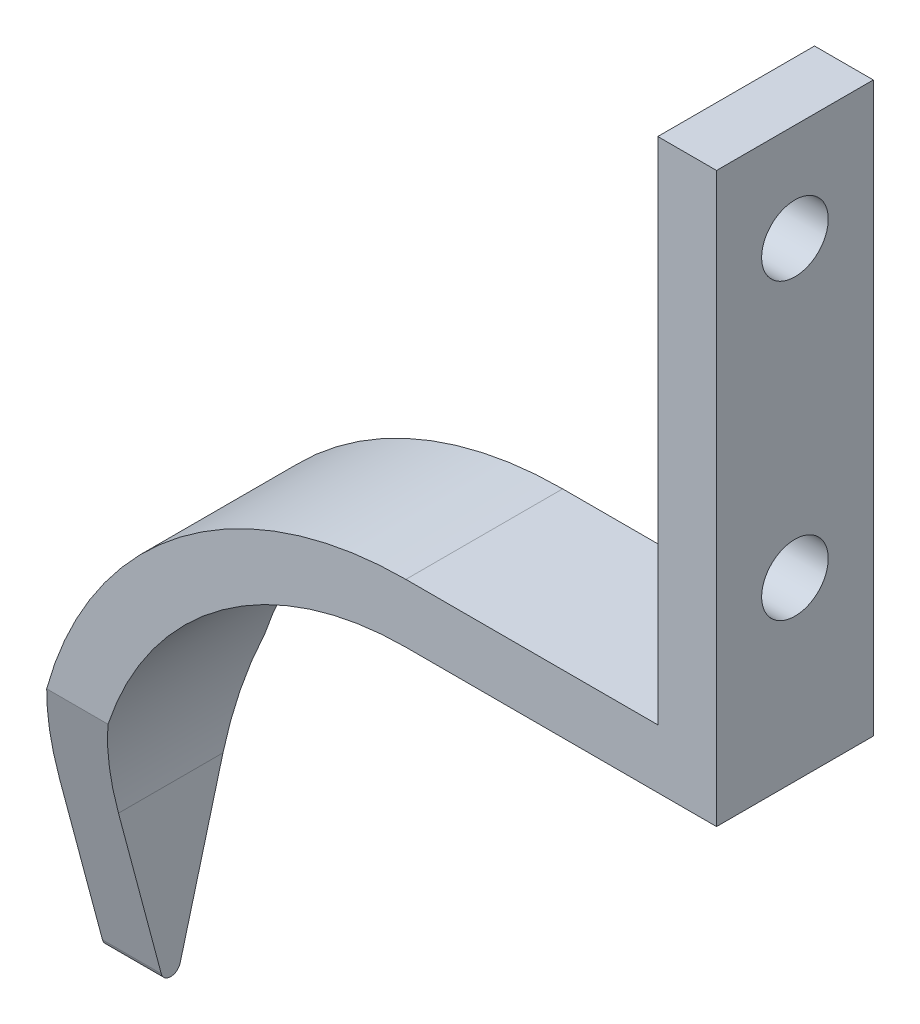
ISO-10303-21;
HEADER;
FILE_DESCRIPTION(('STEP AP214'),'2;1');
FILE_NAME('part.step','',(''),(''),'','','');
FILE_SCHEMA(('AUTOMOTIVE_DESIGN { 1 0 10303 214 1 1 1 1 }'));
ENDSEC;
DATA;
#1=APPLICATION_CONTEXT('core data for automotive mechanical design processes');
#2=APPLICATION_PROTOCOL_DEFINITION('international standard','automotive_design',2000,#1);
#3=PRODUCT_CONTEXT('',#1,'mechanical');
#4=PRODUCT('Part','Part','',(#3));
#5=PRODUCT_RELATED_PRODUCT_CATEGORY('part','',(#4));
#6=PRODUCT_DEFINITION_FORMATION('','',#4);
#7=PRODUCT_DEFINITION_CONTEXT('part definition',#1,'design');
#8=PRODUCT_DEFINITION('design','',#6,#7);
#9=PRODUCT_DEFINITION_SHAPE('','',#8);
#10=(LENGTH_UNIT() NAMED_UNIT(*) SI_UNIT(.MILLI.,.METRE.));
#11=(NAMED_UNIT(*) PLANE_ANGLE_UNIT() SI_UNIT($,.RADIAN.));
#12=(NAMED_UNIT(*) SI_UNIT($,.STERADIAN.) SOLID_ANGLE_UNIT());
#13=UNCERTAINTY_MEASURE_WITH_UNIT(LENGTH_MEASURE(1.E-05),#10,'distance_accuracy_value','');
#14=(GEOMETRIC_REPRESENTATION_CONTEXT(3) GLOBAL_UNCERTAINTY_ASSIGNED_CONTEXT((#13)) GLOBAL_UNIT_ASSIGNED_CONTEXT((#10,
#11,#12)) REPRESENTATION_CONTEXT('',''));
#15=CARTESIAN_POINT('',(0.,0.,0.));
#16=DIRECTION('',(0.,0.,1.));
#17=DIRECTION('',(1.,0.,0.));
#18=AXIS2_PLACEMENT_3D('',#15,#16,#17);
#19=CARTESIAN_POINT('',(-59.,0.,-4.00000000000001));
#20=DIRECTION('',(1.,0.,0.));
#21=DIRECTION('',(0.,0.,-1.));
#22=AXIS2_PLACEMENT_3D('',#19,#20,#21);
#23=PLANE('',#22);
#24=DIRECTION('',(0.,0.966234939601246,-0.257662650560332));
#25=VECTOR('',#24,1.);
#26=CARTESIAN_POINT('',(-59.,2.98755186721991,11.2033195020747));
#27=LINE('',#26,#25);
#28=CARTESIAN_POINT('',(-59.,46.8116905117523,-0.483117469800625));
#29=VERTEX_POINT('',#28);
#30=CARTESIAN_POINT('',(-59.,55.,-2.66666666666667));
#31=VERTEX_POINT('',#30);
#32=EDGE_CURVE('E130',#29,#31,#27,.T.);
#33=ORIENTED_EDGE('',*,*,#32,.F.);
#34=CARTESIAN_POINT('',(-59.,46.9405218370325,0.));
#35=DIRECTION('',(1.,0.,0.));
#36=DIRECTION('',(0.,0.,-1.));
#37=AXIS2_PLACEMENT_3D('',#34,#35,#36);
#38=CIRCLE('',#37,0.5);
#39=CARTESIAN_POINT('',(-59.,46.8116905117523,0.48311746980061));
#40=VERTEX_POINT('',#39);
#41=EDGE_CURVE('E58',#29,#40,#38,.F.);
#42=ORIENTED_EDGE('',*,*,#41,.T.);
#43=DIRECTION('',(0.,-0.966234939601246,-0.257662650560332));
#44=VECTOR('',#43,1.);
#45=CARTESIAN_POINT('',(-59.,2.98755186721991,-11.2033195020747));
#46=LINE('',#45,#44);
#47=CARTESIAN_POINT('',(-59.,55.,2.66666666666666));
#48=VERTEX_POINT('',#47);
#49=EDGE_CURVE('E124',#48,#40,#46,.T.);
#50=ORIENTED_EDGE('',*,*,#49,.F.);
#51=DIRECTION('',(0.,0.,1.));
#52=VECTOR('',#51,1.);
#53=CARTESIAN_POINT('',(-59.,55.,-4.));
#54=LINE('',#53,#52);
#55=EDGE_CURVE('E134',#31,#48,#54,.T.);
#56=ORIENTED_EDGE('',*,*,#55,.F.);
#57=EDGE_LOOP('',(#33,#42,#50,#56));
#58=FACE_BOUND('',#57,.T.);
#59=ADVANCED_FACE('F36',(#58),#23,.F.);
#60=CARTESIAN_POINT('',(-40.,55.,-4.));
#61=DIRECTION('',(0.,0.,1.));
#62=DIRECTION('',(1.,0.,0.));
#63=AXIS2_PLACEMENT_3D('',#60,#61,#62);
#64=CYLINDRICAL_SURFACE('',#63,19.);
#65=ORIENTED_EDGE('',*,*,#55,.T.);
#66=CARTESIAN_POINT('',(-40.,55.,2.66666666666666));
#67=DIRECTION('',(0.,0.257662650560332,-0.966234939601246));
#68=DIRECTION('',(0.,0.966234939601247,0.257662650560332));
#69=AXIS2_PLACEMENT_3D('',#66,#67,#68);
#70=ELLIPSE('',#69,19.6639546152627,19.);
#71=CARTESIAN_POINT('',(-58.3303027798234,60.,4.));
#72=VERTEX_POINT('',#71);
#73=EDGE_CURVE('E122',#48,#72,#70,.T.);
#74=ORIENTED_EDGE('',*,*,#73,.T.);
#75=CARTESIAN_POINT('',(-40.,55.,4.));
#76=DIRECTION('',(0.,0.,-1.));
#77=DIRECTION('',(-1.,0.,0.));
#78=AXIS2_PLACEMENT_3D('',#75,#76,#77);
#79=CIRCLE('',#78,19.);
#80=CARTESIAN_POINT('',(-40.,74.,4.));
#81=VERTEX_POINT('',#80);
#82=EDGE_CURVE('E168',#72,#81,#79,.T.);
#83=ORIENTED_EDGE('',*,*,#82,.T.);
#84=DIRECTION('',(0.,0.,1.));
#85=VECTOR('',#84,1.);
#86=CARTESIAN_POINT('',(-40.,74.,-4.));
#87=LINE('',#86,#85);
#88=CARTESIAN_POINT('',(-40.,74.,-4.));
#89=VERTEX_POINT('',#88);
#90=EDGE_CURVE('E142',#89,#81,#87,.T.);
#91=ORIENTED_EDGE('',*,*,#90,.F.);
#92=CARTESIAN_POINT('',(-40.,55.,-4.));
#93=DIRECTION('',(0.,0.,-1.));
#94=DIRECTION('',(-1.,0.,0.));
#95=AXIS2_PLACEMENT_3D('',#92,#93,#94);
#96=CIRCLE('',#95,19.);
#97=CARTESIAN_POINT('',(-58.3303027798234,60.,-4.));
#98=VERTEX_POINT('',#97);
#99=EDGE_CURVE('E169',#98,#89,#96,.T.);
#100=ORIENTED_EDGE('',*,*,#99,.F.);
#101=CARTESIAN_POINT('',(-40.,55.,-2.66666666666667));
#102=DIRECTION('',(0.,0.257662650560332,0.966234939601246));
#103=DIRECTION('',(0.,-0.966234939601247,0.257662650560332));
#104=AXIS2_PLACEMENT_3D('',#101,#102,#103);
#105=ELLIPSE('',#104,19.6639546152627,19.);
#106=EDGE_CURVE('E140',#98,#31,#105,.T.);
#107=ORIENTED_EDGE('',*,*,#106,.T.);
#108=EDGE_LOOP('',(#65,#74,#83,#91,#100,#107));
#109=FACE_BOUND('',#108,.T.);
#110=ADVANCED_FACE('F138',(#109),#64,.T.);
#111=CARTESIAN_POINT('',(0.,74.,-4.));
#112=DIRECTION('',(0.,-1.,0.));
#113=DIRECTION('',(1.,0.,0.));
#114=AXIS2_PLACEMENT_3D('',#111,#112,#113);
#115=PLANE('',#114);
#116=DIRECTION('',(1.,0.,0.));
#117=VECTOR('',#116,1.);
#118=CARTESIAN_POINT('',(0.,74.,4.));
#119=LINE('',#118,#117);
#120=CARTESIAN_POINT('',(-27.145,74.,4.));
#121=VERTEX_POINT('',#120);
#122=EDGE_CURVE('E187',#81,#121,#119,.T.);
#123=ORIENTED_EDGE('',*,*,#122,.T.);
#124=DIRECTION('',(0.,0.,1.));
#125=VECTOR('',#124,1.);
#126=CARTESIAN_POINT('',(-27.145,74.,-4.));
#127=LINE('',#126,#125);
#128=CARTESIAN_POINT('',(-27.145,74.,-4.));
#129=VERTEX_POINT('',#128);
#130=EDGE_CURVE('E147',#129,#121,#127,.T.);
#131=ORIENTED_EDGE('',*,*,#130,.F.);
#132=DIRECTION('',(1.,0.,0.));
#133=VECTOR('',#132,1.);
#134=CARTESIAN_POINT('',(0.,74.,-4.));
#135=LINE('',#134,#133);
#136=EDGE_CURVE('E171',#89,#129,#135,.T.);
#137=ORIENTED_EDGE('',*,*,#136,.F.);
#138=ORIENTED_EDGE('',*,*,#90,.T.);
#139=EDGE_LOOP('',(#123,#131,#137,#138));
#140=FACE_BOUND('',#139,.T.);
#141=ADVANCED_FACE('F242',(#140),#115,.F.);
#142=CARTESIAN_POINT('',(-27.145,0.,-4.));
#143=DIRECTION('',(1.,0.,0.));
#144=DIRECTION('',(0.,1.,0.));
#145=AXIS2_PLACEMENT_3D('',#142,#143,#144);
#146=PLANE('',#145);
#147=CARTESIAN_POINT('',(-27.145,80.,0.));
#148=DIRECTION('',(-1.,0.,0.));
#149=DIRECTION('',(0.,0.,1.));
#150=AXIS2_PLACEMENT_3D('',#147,#148,#149);
#151=CIRCLE('',#150,1.70000000000001);
#152=CARTESIAN_POINT('',(-27.145,80.,1.70000000000001));
#153=VERTEX_POINT('',#152);
#154=EDGE_CURVE('E397',#153,#153,#151,.T.);
#155=ORIENTED_EDGE('',*,*,#154,.F.);
#156=EDGE_LOOP('',(#155));
#157=FACE_BOUND('',#156,.T.);
#158=CARTESIAN_POINT('',(-27.145,95.,0.));
#159=DIRECTION('',(-1.,0.,0.));
#160=DIRECTION('',(0.,0.,1.));
#161=AXIS2_PLACEMENT_3D('',#158,#159,#160);
#162=CIRCLE('',#161,1.70000000000001);
#163=CARTESIAN_POINT('',(-27.145,95.,1.70000000000001));
#164=VERTEX_POINT('',#163);
#165=EDGE_CURVE('E394',#164,#164,#162,.T.);
#166=ORIENTED_EDGE('',*,*,#165,.F.);
#167=EDGE_LOOP('',(#166));
#168=FACE_BOUND('',#167,.T.);
#169=DIRECTION('',(0.,1.,0.));
#170=VECTOR('',#169,1.);
#171=CARTESIAN_POINT('',(-27.145,0.,4.));
#172=LINE('',#171,#170);
#173=CARTESIAN_POINT('',(-27.145,100.,4.));
#174=VERTEX_POINT('',#173);
#175=EDGE_CURVE('E189',#121,#174,#172,.T.);
#176=ORIENTED_EDGE('',*,*,#175,.T.);
#177=DIRECTION('',(0.,0.,1.));
#178=VECTOR('',#177,1.);
#179=CARTESIAN_POINT('',(-27.145,100.,-4.));
#180=LINE('',#179,#178);
#181=CARTESIAN_POINT('',(-27.145,100.,-4.));
#182=VERTEX_POINT('',#181);
#183=EDGE_CURVE('E210',#182,#174,#180,.T.);
#184=ORIENTED_EDGE('',*,*,#183,.F.);
#185=DIRECTION('',(0.,1.,0.));
#186=VECTOR('',#185,1.);
#187=CARTESIAN_POINT('',(-27.145,0.,-4.));
#188=LINE('',#187,#186);
#189=EDGE_CURVE('E174',#129,#182,#188,.T.);
#190=ORIENTED_EDGE('',*,*,#189,.F.);
#191=ORIENTED_EDGE('',*,*,#130,.T.);
#192=EDGE_LOOP('',(#176,#184,#190,#191));
#193=FACE_BOUND('',#192,.T.);
#194=ADVANCED_FACE('F217',(#157,#168,#193),#146,.F.);
#195=CARTESIAN_POINT('',(0.,100.,-4.));
#196=DIRECTION('',(0.,-1.,0.));
#197=DIRECTION('',(0.,0.,-1.));
#198=AXIS2_PLACEMENT_3D('',#195,#196,#197);
#199=PLANE('',#198);
#200=DIRECTION('',(1.,0.,0.));
#201=VECTOR('',#200,1.);
#202=CARTESIAN_POINT('',(0.,100.,4.));
#203=LINE('',#202,#201);
#204=CARTESIAN_POINT('',(-24.145,100.,4.));
#205=VERTEX_POINT('',#204);
#206=EDGE_CURVE('E191',#174,#205,#203,.T.);
#207=ORIENTED_EDGE('',*,*,#206,.T.);
#208=DIRECTION('',(0.,0.,1.));
#209=VECTOR('',#208,1.);
#210=CARTESIAN_POINT('',(-24.145,100.,-4.));
#211=LINE('',#210,#209);
#212=CARTESIAN_POINT('',(-24.145,100.,-4.));
#213=VERTEX_POINT('',#212);
#214=EDGE_CURVE('E207',#213,#205,#211,.T.);
#215=ORIENTED_EDGE('',*,*,#214,.F.);
#216=DIRECTION('',(1.,0.,0.));
#217=VECTOR('',#216,1.);
#218=CARTESIAN_POINT('',(0.,100.,-4.));
#219=LINE('',#218,#217);
#220=EDGE_CURVE('E176',#182,#213,#219,.T.);
#221=ORIENTED_EDGE('',*,*,#220,.F.);
#222=ORIENTED_EDGE('',*,*,#183,.T.);
#223=EDGE_LOOP('',(#207,#215,#221,#222));
#224=FACE_BOUND('',#223,.T.);
#225=ADVANCED_FACE('F229',(#224),#199,.F.);
#226=CARTESIAN_POINT('',(-24.145,0.,-4.));
#227=DIRECTION('',(-1.,0.,0.));
#228=DIRECTION('',(0.,0.,1.));
#229=AXIS2_PLACEMENT_3D('',#226,#227,#228);
#230=PLANE('',#229);
#231=CARTESIAN_POINT('',(-24.145,80.,0.));
#232=DIRECTION('',(-1.,0.,0.));
#233=DIRECTION('',(0.,0.,1.));
#234=AXIS2_PLACEMENT_3D('',#231,#232,#233);
#235=CIRCLE('',#234,1.70000000000001);
#236=CARTESIAN_POINT('',(-24.145,80.,1.70000000000001));
#237=VERTEX_POINT('',#236);
#238=EDGE_CURVE('E135',#237,#237,#235,.T.);
#239=ORIENTED_EDGE('',*,*,#238,.T.);
#240=EDGE_LOOP('',(#239));
#241=FACE_BOUND('',#240,.T.);
#242=CARTESIAN_POINT('',(-24.145,95.,0.));
#243=DIRECTION('',(-1.,0.,0.));
#244=DIRECTION('',(0.,0.,1.));
#245=AXIS2_PLACEMENT_3D('',#242,#243,#244);
#246=CIRCLE('',#245,1.70000000000001);
#247=CARTESIAN_POINT('',(-24.145,95.,1.70000000000001));
#248=VERTEX_POINT('',#247);
#249=EDGE_CURVE('E391',#248,#248,#246,.T.);
#250=ORIENTED_EDGE('',*,*,#249,.T.);
#251=EDGE_LOOP('',(#250));
#252=FACE_BOUND('',#251,.T.);
#253=DIRECTION('',(0.,-1.,0.));
#254=VECTOR('',#253,1.);
#255=CARTESIAN_POINT('',(-24.145,0.,4.));
#256=LINE('',#255,#254);
#257=CARTESIAN_POINT('',(-24.145,71.,4.));
#258=VERTEX_POINT('',#257);
#259=EDGE_CURVE('E193',#205,#258,#256,.T.);
#260=ORIENTED_EDGE('',*,*,#259,.T.);
#261=DIRECTION('',(0.,0.,1.));
#262=VECTOR('',#261,1.);
#263=CARTESIAN_POINT('',(-24.145,71.,-4.));
#264=LINE('',#263,#262);
#265=CARTESIAN_POINT('',(-24.145,71.,-4.));
#266=VERTEX_POINT('',#265);
#267=EDGE_CURVE('E204',#266,#258,#264,.T.);
#268=ORIENTED_EDGE('',*,*,#267,.F.);
#269=DIRECTION('',(0.,-1.,0.));
#270=VECTOR('',#269,1.);
#271=CARTESIAN_POINT('',(-24.145,0.,-4.));
#272=LINE('',#271,#270);
#273=EDGE_CURVE('E178',#213,#266,#272,.T.);
#274=ORIENTED_EDGE('',*,*,#273,.F.);
#275=ORIENTED_EDGE('',*,*,#214,.T.);
#276=EDGE_LOOP('',(#260,#268,#274,#275));
#277=FACE_BOUND('',#276,.T.);
#278=ADVANCED_FACE('F233',(#241,#252,#277),#230,.F.);
#279=CARTESIAN_POINT('',(0.,71.,-4.));
#280=DIRECTION('',(0.,1.,0.));
#281=DIRECTION('',(0.,0.,1.));
#282=AXIS2_PLACEMENT_3D('',#279,#280,#281);
#283=PLANE('',#282);
#284=DIRECTION('',(-1.,0.,0.));
#285=VECTOR('',#284,1.);
#286=CARTESIAN_POINT('',(0.,71.,4.));
#287=LINE('',#286,#285);
#288=CARTESIAN_POINT('',(-40.,71.,4.));
#289=VERTEX_POINT('',#288);
#290=EDGE_CURVE('E195',#258,#289,#287,.T.);
#291=ORIENTED_EDGE('',*,*,#290,.T.);
#292=DIRECTION('',(0.,0.,1.));
#293=VECTOR('',#292,1.);
#294=CARTESIAN_POINT('',(-40.,71.,-4.));
#295=LINE('',#294,#293);
#296=CARTESIAN_POINT('',(-40.,71.,-4.));
#297=VERTEX_POINT('',#296);
#298=EDGE_CURVE('E201',#297,#289,#295,.T.);
#299=ORIENTED_EDGE('',*,*,#298,.F.);
#300=DIRECTION('',(-1.,0.,0.));
#301=VECTOR('',#300,1.);
#302=CARTESIAN_POINT('',(0.,71.,-4.));
#303=LINE('',#302,#301);
#304=EDGE_CURVE('E180',#266,#297,#303,.T.);
#305=ORIENTED_EDGE('',*,*,#304,.F.);
#306=ORIENTED_EDGE('',*,*,#267,.T.);
#307=EDGE_LOOP('',(#291,#299,#305,#306));
#308=FACE_BOUND('',#307,.T.);
#309=ADVANCED_FACE('F252',(#308),#283,.F.);
#310=CARTESIAN_POINT('',(-40.,55.,-4.));
#311=DIRECTION('',(0.,0.,1.));
#312=DIRECTION('',(1.,0.,0.));
#313=AXIS2_PLACEMENT_3D('',#310,#311,#312);
#314=CYLINDRICAL_SURFACE('',#313,16.);
#315=CARTESIAN_POINT('',(-40.,55.,2.66666666666666));
#316=DIRECTION('',(0.,0.257662650560332,-0.966234939601246));
#317=DIRECTION('',(0.,0.966234939601247,0.257662650560332));
#318=AXIS2_PLACEMENT_3D('',#315,#316,#317);
#319=ELLIPSE('',#318,16.5591196760107,16.);
#320=CARTESIAN_POINT('',(-56.,55.,2.66666666666666));
#321=VERTEX_POINT('',#320);
#322=CARTESIAN_POINT('',(-55.1986841535707,60.,4.));
#323=VERTEX_POINT('',#322);
#324=EDGE_CURVE('E131',#321,#323,#319,.T.);
#325=ORIENTED_EDGE('',*,*,#324,.F.);
#326=DIRECTION('',(0.,0.,1.));
#327=VECTOR('',#326,1.);
#328=CARTESIAN_POINT('',(-56.,55.,-4.));
#329=LINE('',#328,#327);
#330=CARTESIAN_POINT('',(-56.,55.,-2.66666666666668));
#331=VERTEX_POINT('',#330);
#332=EDGE_CURVE('E185',#331,#321,#329,.T.);
#333=ORIENTED_EDGE('',*,*,#332,.F.);
#334=CARTESIAN_POINT('',(-40.,55.,-2.66666666666667));
#335=DIRECTION('',(0.,0.257662650560332,0.966234939601246));
#336=DIRECTION('',(0.,-0.966234939601247,0.257662650560332));
#337=AXIS2_PLACEMENT_3D('',#334,#335,#336);
#338=ELLIPSE('',#337,16.5591196760107,16.);
#339=CARTESIAN_POINT('',(-55.1986841535707,60.,-4.));
#340=VERTEX_POINT('',#339);
#341=EDGE_CURVE('E162',#340,#331,#338,.T.);
#342=ORIENTED_EDGE('',*,*,#341,.F.);
#343=CARTESIAN_POINT('',(-40.,55.,-4.));
#344=DIRECTION('',(0.,0.,-1.));
#345=DIRECTION('',(-1.,0.,0.));
#346=AXIS2_PLACEMENT_3D('',#343,#344,#345);
#347=CIRCLE('',#346,16.);
#348=EDGE_CURVE('E183',#340,#297,#347,.T.);
#349=ORIENTED_EDGE('',*,*,#348,.T.);
#350=ORIENTED_EDGE('',*,*,#298,.T.);
#351=CARTESIAN_POINT('',(-40.,55.,4.));
#352=DIRECTION('',(0.,0.,-1.));
#353=DIRECTION('',(-1.,0.,0.));
#354=AXIS2_PLACEMENT_3D('',#351,#352,#353);
#355=CIRCLE('',#354,16.);
#356=EDGE_CURVE('E172',#323,#289,#355,.T.);
#357=ORIENTED_EDGE('',*,*,#356,.F.);
#358=EDGE_LOOP('',(#325,#333,#342,#349,#350,#357));
#359=FACE_BOUND('',#358,.T.);
#360=ADVANCED_FACE('F248',(#359),#314,.F.);
#361=CARTESIAN_POINT('',(-56.,0.,-4.00000000000001));
#362=DIRECTION('',(-1.,0.,0.));
#363=DIRECTION('',(0.,-1.,0.));
#364=AXIS2_PLACEMENT_3D('',#361,#362,#363);
#365=PLANE('',#364);
#366=DIRECTION('',(0.,-0.966234939601247,-0.257662650560332));
#367=VECTOR('',#366,1.);
#368=CARTESIAN_POINT('',(-56.,1.99170124481324,-11.4688796680498));
#369=LINE('',#368,#367);
#370=CARTESIAN_POINT('',(-56.,46.8116905117523,0.48311746980062));
#371=VERTEX_POINT('',#370);
#372=EDGE_CURVE('E244',#321,#371,#369,.T.);
#373=ORIENTED_EDGE('',*,*,#372,.T.);
#374=CARTESIAN_POINT('',(-56.,46.9405218370325,0.));
#375=DIRECTION('',(-1.,0.,0.));
#376=DIRECTION('',(0.,-1.,0.));
#377=AXIS2_PLACEMENT_3D('',#374,#375,#376);
#378=CIRCLE('',#377,0.5);
#379=CARTESIAN_POINT('',(-56.,46.8116905117523,-0.483117469800636));
#380=VERTEX_POINT('',#379);
#381=EDGE_CURVE('E11',#371,#380,#378,.F.);
#382=ORIENTED_EDGE('',*,*,#381,.T.);
#383=DIRECTION('',(0.,0.966234939601247,-0.257662650560332));
#384=VECTOR('',#383,1.);
#385=CARTESIAN_POINT('',(-56.,3.98340248962651,10.9377593360996));
#386=LINE('',#385,#384);
#387=EDGE_CURVE('E158',#380,#331,#386,.T.);
#388=ORIENTED_EDGE('',*,*,#387,.T.);
#389=ORIENTED_EDGE('',*,*,#332,.T.);
#390=EDGE_LOOP('',(#373,#382,#388,#389));
#391=FACE_BOUND('',#390,.T.);
#392=ADVANCED_FACE('F259',(#391),#365,.F.);
#393=CARTESIAN_POINT('',(0.,0.,-4.));
#394=DIRECTION('',(0.,0.,-1.));
#395=DIRECTION('',(-1.,0.,0.));
#396=AXIS2_PLACEMENT_3D('',#393,#394,#395);
#397=PLANE('',#396);
#398=DIRECTION('',(1.,0.,0.));
#399=VECTOR('',#398,1.);
#400=CARTESIAN_POINT('',(0.,60.,-4.));
#401=LINE('',#400,#399);
#402=EDGE_CURVE('E141',#98,#340,#401,.T.);
#403=ORIENTED_EDGE('',*,*,#402,.F.);
#404=ORIENTED_EDGE('',*,*,#99,.T.);
#405=ORIENTED_EDGE('',*,*,#136,.T.);
#406=ORIENTED_EDGE('',*,*,#189,.T.);
#407=ORIENTED_EDGE('',*,*,#220,.T.);
#408=ORIENTED_EDGE('',*,*,#273,.T.);
#409=ORIENTED_EDGE('',*,*,#304,.T.);
#410=ORIENTED_EDGE('',*,*,#348,.F.);
#411=EDGE_LOOP('',(#403,#404,#405,#406,#407,#408,#409,#410));
#412=FACE_BOUND('',#411,.T.);
#413=ADVANCED_FACE('F238',(#412),#397,.T.);
#414=CARTESIAN_POINT('',(0.,0.,4.));
#415=DIRECTION('',(0.,0.,-1.));
#416=DIRECTION('',(-1.,0.,0.));
#417=AXIS2_PLACEMENT_3D('',#414,#415,#416);
#418=PLANE('',#417);
#419=ORIENTED_EDGE('',*,*,#82,.F.);
#420=DIRECTION('',(-1.,0.,0.));
#421=VECTOR('',#420,1.);
#422=CARTESIAN_POINT('',(-24.145,60.,4.));
#423=LINE('',#422,#421);
#424=EDGE_CURVE('E126',#323,#72,#423,.T.);
#425=ORIENTED_EDGE('',*,*,#424,.F.);
#426=ORIENTED_EDGE('',*,*,#356,.T.);
#427=ORIENTED_EDGE('',*,*,#290,.F.);
#428=ORIENTED_EDGE('',*,*,#259,.F.);
#429=ORIENTED_EDGE('',*,*,#206,.F.);
#430=ORIENTED_EDGE('',*,*,#175,.F.);
#431=ORIENTED_EDGE('',*,*,#122,.F.);
#432=EDGE_LOOP('',(#419,#425,#426,#427,#428,#429,#430,#431));
#433=FACE_BOUND('',#432,.T.);
#434=ADVANCED_FACE('F224',(#433),#418,.F.);
#435=CARTESIAN_POINT('',(-24.145,2.98755186721991,11.2033195020747));
#436=DIRECTION('',(0.,0.257662650560332,0.966234939601246));
#437=DIRECTION('',(0.,-0.966234939601247,0.257662650560332));
#438=AXIS2_PLACEMENT_3D('',#435,#436,#437);
#439=PLANE('',#438);
#440=ORIENTED_EDGE('',*,*,#387,.F.);
#441=DIRECTION('',(-1.,0.,0.));
#442=VECTOR('',#441,1.);
#443=CARTESIAN_POINT('',(-24.145,46.8116905117523,-0.483117469800625));
#444=LINE('',#443,#442);
#445=EDGE_CURVE('E144',#380,#29,#444,.T.);
#446=ORIENTED_EDGE('',*,*,#445,.T.);
#447=ORIENTED_EDGE('',*,*,#32,.T.);
#448=ORIENTED_EDGE('',*,*,#106,.F.);
#449=ORIENTED_EDGE('',*,*,#402,.T.);
#450=ORIENTED_EDGE('',*,*,#341,.T.);
#451=EDGE_LOOP('',(#440,#446,#447,#448,#449,#450));
#452=FACE_BOUND('',#451,.T.);
#453=ADVANCED_FACE('F156',(#452),#439,.F.);
#454=CARTESIAN_POINT('',(-24.145,2.98755186721991,-11.2033195020747));
#455=DIRECTION('',(0.,0.257662650560332,-0.966234939601246));
#456=DIRECTION('',(0.,0.966234939601247,0.257662650560332));
#457=AXIS2_PLACEMENT_3D('',#454,#455,#456);
#458=PLANE('',#457);
#459=ORIENTED_EDGE('',*,*,#49,.T.);
#460=DIRECTION('',(-1.,0.,0.));
#461=VECTOR('',#460,1.);
#462=CARTESIAN_POINT('',(-24.145,46.8116905117523,0.483117469800618));
#463=LINE('',#462,#461);
#464=EDGE_CURVE('E44',#40,#371,#463,.F.);
#465=ORIENTED_EDGE('',*,*,#464,.T.);
#466=ORIENTED_EDGE('',*,*,#372,.F.);
#467=ORIENTED_EDGE('',*,*,#324,.T.);
#468=ORIENTED_EDGE('',*,*,#424,.T.);
#469=ORIENTED_EDGE('',*,*,#73,.F.);
#470=EDGE_LOOP('',(#459,#465,#466,#467,#468,#469));
#471=FACE_BOUND('',#470,.T.);
#472=ADVANCED_FACE('F123',(#471),#458,.F.);
#473=CARTESIAN_POINT('',(-24.145,46.9405218370325,0.));
#474=DIRECTION('',(-1.,0.,0.));
#475=DIRECTION('',(0.,0.,1.));
#476=AXIS2_PLACEMENT_3D('',#473,#474,#475);
#477=CYLINDRICAL_SURFACE('',#476,0.5);
#478=ORIENTED_EDGE('',*,*,#381,.F.);
#479=ORIENTED_EDGE('',*,*,#464,.F.);
#480=ORIENTED_EDGE('',*,*,#41,.F.);
#481=ORIENTED_EDGE('',*,*,#445,.F.);
#482=EDGE_LOOP('',(#478,#479,#480,#481));
#483=FACE_BOUND('',#482,.T.);
#484=ADVANCED_FACE('F38',(#483),#477,.T.);
#485=CARTESIAN_POINT('',(-24.145,95.,0.));
#486=DIRECTION('',(-1.,0.,0.));
#487=DIRECTION('',(0.,0.,1.));
#488=AXIS2_PLACEMENT_3D('',#485,#486,#487);
#489=CYLINDRICAL_SURFACE('',#488,1.70000000000001);
#490=CARTESIAN_POINT('',(-24.145,95.,1.70000000000001));
#491=CARTESIAN_POINT('',(-24.17625,95.,1.70000000000001));
#492=CARTESIAN_POINT('',(-24.2075,95.,1.70000000000001));
#493=CARTESIAN_POINT('',(-24.27,95.,1.70000000000001));
#494=CARTESIAN_POINT('',(-24.30125,95.,1.70000000000001));
#495=CARTESIAN_POINT('',(-24.36375,95.,1.70000000000001));
#496=CARTESIAN_POINT('',(-24.395,95.,1.70000000000001));
#497=CARTESIAN_POINT('',(-24.4575,95.,1.70000000000001));
#498=CARTESIAN_POINT('',(-24.48875,95.,1.70000000000001));
#499=CARTESIAN_POINT('',(-24.55125,95.,1.70000000000001));
#500=CARTESIAN_POINT('',(-24.5825,95.,1.70000000000001));
#501=CARTESIAN_POINT('',(-24.645,95.,1.70000000000001));
#502=CARTESIAN_POINT('',(-24.67625,95.,1.70000000000001));
#503=CARTESIAN_POINT('',(-24.73875,95.,1.70000000000001));
#504=CARTESIAN_POINT('',(-24.77,95.,1.70000000000001));
#505=CARTESIAN_POINT('',(-24.8325,95.,1.70000000000001));
#506=CARTESIAN_POINT('',(-24.86375,95.,1.70000000000001));
#507=CARTESIAN_POINT('',(-24.92625,95.,1.70000000000001));
#508=CARTESIAN_POINT('',(-24.9575,95.,1.70000000000001));
#509=CARTESIAN_POINT('',(-25.02,95.,1.70000000000001));
#510=CARTESIAN_POINT('',(-25.05125,95.,1.70000000000001));
#511=CARTESIAN_POINT('',(-25.11375,95.,1.70000000000001));
#512=CARTESIAN_POINT('',(-25.145,95.,1.70000000000001));
#513=CARTESIAN_POINT('',(-25.2075,95.,1.70000000000001));
#514=CARTESIAN_POINT('',(-25.23875,95.,1.70000000000001));
#515=CARTESIAN_POINT('',(-25.30125,95.,1.70000000000001));
#516=CARTESIAN_POINT('',(-25.3325,95.,1.70000000000001));
#517=CARTESIAN_POINT('',(-25.395,95.,1.70000000000001));
#518=CARTESIAN_POINT('',(-25.42625,95.,1.70000000000001));
#519=CARTESIAN_POINT('',(-25.48875,95.,1.70000000000001));
#520=CARTESIAN_POINT('',(-25.52,95.,1.70000000000001));
#521=CARTESIAN_POINT('',(-25.5825,95.,1.70000000000001));
#522=CARTESIAN_POINT('',(-25.61375,95.,1.70000000000001));
#523=CARTESIAN_POINT('',(-25.67625,95.,1.70000000000001));
#524=CARTESIAN_POINT('',(-25.7075,95.,1.70000000000001));
#525=CARTESIAN_POINT('',(-25.77,95.,1.70000000000001));
#526=CARTESIAN_POINT('',(-25.80125,95.,1.70000000000001));
#527=CARTESIAN_POINT('',(-25.86375,95.,1.70000000000001));
#528=CARTESIAN_POINT('',(-25.895,95.,1.70000000000001));
#529=CARTESIAN_POINT('',(-25.9575,95.,1.70000000000001));
#530=CARTESIAN_POINT('',(-25.98875,95.,1.70000000000001));
#531=CARTESIAN_POINT('',(-26.05125,95.,1.70000000000001));
#532=CARTESIAN_POINT('',(-26.0825,95.,1.70000000000001));
#533=CARTESIAN_POINT('',(-26.145,95.,1.70000000000001));
#534=CARTESIAN_POINT('',(-26.17625,95.,1.70000000000001));
#535=CARTESIAN_POINT('',(-26.23875,95.,1.70000000000001));
#536=CARTESIAN_POINT('',(-26.27,95.,1.70000000000001));
#537=CARTESIAN_POINT('',(-26.3325,95.,1.70000000000001));
#538=CARTESIAN_POINT('',(-26.36375,95.,1.70000000000001));
#539=CARTESIAN_POINT('',(-26.42625,95.,1.70000000000001));
#540=CARTESIAN_POINT('',(-26.4575,95.,1.70000000000001));
#541=CARTESIAN_POINT('',(-26.52,95.,1.70000000000001));
#542=CARTESIAN_POINT('',(-26.55125,95.,1.70000000000001));
#543=CARTESIAN_POINT('',(-26.61375,95.,1.70000000000001));
#544=CARTESIAN_POINT('',(-26.645,95.,1.70000000000001));
#545=CARTESIAN_POINT('',(-26.7075,95.,1.70000000000001));
#546=CARTESIAN_POINT('',(-26.73875,95.,1.70000000000001));
#547=CARTESIAN_POINT('',(-26.80125,95.,1.70000000000001));
#548=CARTESIAN_POINT('',(-26.8325,95.,1.70000000000001));
#549=CARTESIAN_POINT('',(-26.895,95.,1.70000000000001));
#550=CARTESIAN_POINT('',(-26.92625,95.,1.70000000000001));
#551=CARTESIAN_POINT('',(-26.98875,95.,1.70000000000001));
#552=CARTESIAN_POINT('',(-27.02,95.,1.70000000000001));
#553=CARTESIAN_POINT('',(-27.0825,95.,1.70000000000001));
#554=CARTESIAN_POINT('',(-27.11375,95.,1.70000000000001));
#555=CARTESIAN_POINT('',(-27.145,95.,1.70000000000001));
#556=B_SPLINE_CURVE_WITH_KNOTS('',3,(#490,#491,#492,#493,#494,#495,#496,#497,#498,#499,#500,
#501,#502,#503,#504,#505,#506,#507,#508,#509,#510,#511,#512,#513,#514,#515,#516,#517,#518,#519,
#520,#521,#522,#523,#524,#525,#526,#527,#528,#529,#530,#531,#532,#533,#534,#535,#536,#537,#538,
#539,#540,#541,#542,#543,#544,#545,#546,#547,#548,#549,#550,#551,#552,#553,#554,#555),
.UNSPECIFIED.,.F.,.F.,(4,2,2,2,2,2,2,2,2,2,2,2,2,2,2,2,2,2,2,2,2,2,2,2,2,2,2,2,2,2,2,2,4),(0.,
0.0937500000000001,0.1875,0.28125,0.375,0.46875,0.5625,0.656250000000001,0.750000000000001,
0.843749999999997,0.937499999999997,1.03125,1.125,1.21875,1.3125,1.40625,1.5,1.59374999999999,
1.68749999999999,1.78124999999999,1.87499999999999,1.96874999999999,2.06249999999999,2.15625,
2.25,2.34374999999999,2.43749999999999,2.53124999999999,2.62499999999999,2.71874999999999,
2.81249999999999,2.90624999999999,2.99999999999999),.UNSPECIFIED.);
#557=EDGE_CURVE('BSEAM293',#248,#164,#556,.T.);
#558=ORIENTED_EDGE('',*,*,#249,.F.);
#559=ORIENTED_EDGE('',*,*,#165,.T.);
#560=ORIENTED_EDGE('',*,*,#557,.T.);
#561=ORIENTED_EDGE('',*,*,#557,.F.);
#562=EDGE_LOOP('',(#558,#560,#559,#561));
#563=FACE_BOUND('',#562,.T.);
#564=ADVANCED_FACE('F293',(#563),#489,.F.);
#565=CARTESIAN_POINT('',(-24.145,80.,0.));
#566=DIRECTION('',(-1.,0.,0.));
#567=DIRECTION('',(0.,0.,1.));
#568=AXIS2_PLACEMENT_3D('',#565,#566,#567);
#569=CYLINDRICAL_SURFACE('',#568,1.70000000000001);
#570=CARTESIAN_POINT('',(-24.145,80.,1.70000000000001));
#571=CARTESIAN_POINT('',(-24.17625,80.,1.70000000000001));
#572=CARTESIAN_POINT('',(-24.2075,80.,1.70000000000001));
#573=CARTESIAN_POINT('',(-24.27,80.,1.70000000000001));
#574=CARTESIAN_POINT('',(-24.30125,80.,1.70000000000001));
#575=CARTESIAN_POINT('',(-24.36375,80.,1.70000000000001));
#576=CARTESIAN_POINT('',(-24.395,80.,1.70000000000001));
#577=CARTESIAN_POINT('',(-24.4575,80.,1.70000000000001));
#578=CARTESIAN_POINT('',(-24.48875,80.,1.70000000000001));
#579=CARTESIAN_POINT('',(-24.55125,80.,1.70000000000001));
#580=CARTESIAN_POINT('',(-24.5825,80.,1.70000000000001));
#581=CARTESIAN_POINT('',(-24.645,80.,1.70000000000001));
#582=CARTESIAN_POINT('',(-24.67625,80.,1.70000000000001));
#583=CARTESIAN_POINT('',(-24.73875,80.,1.70000000000001));
#584=CARTESIAN_POINT('',(-24.77,80.,1.70000000000001));
#585=CARTESIAN_POINT('',(-24.8325,80.,1.70000000000001));
#586=CARTESIAN_POINT('',(-24.86375,80.,1.70000000000001));
#587=CARTESIAN_POINT('',(-24.92625,80.,1.70000000000001));
#588=CARTESIAN_POINT('',(-24.9575,80.,1.70000000000001));
#589=CARTESIAN_POINT('',(-25.02,80.,1.70000000000001));
#590=CARTESIAN_POINT('',(-25.05125,80.,1.70000000000001));
#591=CARTESIAN_POINT('',(-25.11375,80.,1.70000000000001));
#592=CARTESIAN_POINT('',(-25.145,80.,1.70000000000001));
#593=CARTESIAN_POINT('',(-25.2075,80.,1.70000000000001));
#594=CARTESIAN_POINT('',(-25.23875,80.,1.70000000000001));
#595=CARTESIAN_POINT('',(-25.30125,80.,1.70000000000001));
#596=CARTESIAN_POINT('',(-25.3325,80.,1.70000000000001));
#597=CARTESIAN_POINT('',(-25.395,80.,1.70000000000001));
#598=CARTESIAN_POINT('',(-25.42625,80.,1.70000000000001));
#599=CARTESIAN_POINT('',(-25.48875,80.,1.70000000000001));
#600=CARTESIAN_POINT('',(-25.52,80.,1.70000000000001));
#601=CARTESIAN_POINT('',(-25.5825,80.,1.70000000000001));
#602=CARTESIAN_POINT('',(-25.61375,80.,1.70000000000001));
#603=CARTESIAN_POINT('',(-25.67625,80.,1.70000000000001));
#604=CARTESIAN_POINT('',(-25.7075,80.,1.70000000000001));
#605=CARTESIAN_POINT('',(-25.77,80.,1.70000000000001));
#606=CARTESIAN_POINT('',(-25.80125,80.,1.70000000000001));
#607=CARTESIAN_POINT('',(-25.86375,80.,1.70000000000001));
#608=CARTESIAN_POINT('',(-25.895,80.,1.70000000000001));
#609=CARTESIAN_POINT('',(-25.9575,80.,1.70000000000001));
#610=CARTESIAN_POINT('',(-25.98875,80.,1.70000000000001));
#611=CARTESIAN_POINT('',(-26.05125,80.,1.70000000000001));
#612=CARTESIAN_POINT('',(-26.0825,80.,1.70000000000001));
#613=CARTESIAN_POINT('',(-26.145,80.,1.70000000000001));
#614=CARTESIAN_POINT('',(-26.17625,80.,1.70000000000001));
#615=CARTESIAN_POINT('',(-26.23875,80.,1.70000000000001));
#616=CARTESIAN_POINT('',(-26.27,80.,1.70000000000001));
#617=CARTESIAN_POINT('',(-26.3325,80.,1.70000000000001));
#618=CARTESIAN_POINT('',(-26.36375,80.,1.70000000000001));
#619=CARTESIAN_POINT('',(-26.42625,80.,1.70000000000001));
#620=CARTESIAN_POINT('',(-26.4575,80.,1.70000000000001));
#621=CARTESIAN_POINT('',(-26.52,80.,1.70000000000001));
#622=CARTESIAN_POINT('',(-26.55125,80.,1.70000000000001));
#623=CARTESIAN_POINT('',(-26.61375,80.,1.70000000000001));
#624=CARTESIAN_POINT('',(-26.645,80.,1.70000000000001));
#625=CARTESIAN_POINT('',(-26.7075,80.,1.70000000000001));
#626=CARTESIAN_POINT('',(-26.73875,80.,1.70000000000001));
#627=CARTESIAN_POINT('',(-26.80125,80.,1.70000000000001));
#628=CARTESIAN_POINT('',(-26.8325,80.,1.70000000000001));
#629=CARTESIAN_POINT('',(-26.895,80.,1.70000000000001));
#630=CARTESIAN_POINT('',(-26.92625,80.,1.70000000000001));
#631=CARTESIAN_POINT('',(-26.98875,80.,1.70000000000001));
#632=CARTESIAN_POINT('',(-27.02,80.,1.70000000000001));
#633=CARTESIAN_POINT('',(-27.0825,80.,1.70000000000001));
#634=CARTESIAN_POINT('',(-27.11375,80.,1.70000000000001));
#635=CARTESIAN_POINT('',(-27.145,80.,1.70000000000001));
#636=B_SPLINE_CURVE_WITH_KNOTS('',3,(#570,#571,#572,#573,#574,#575,#576,#577,#578,#579,#580,
#581,#582,#583,#584,#585,#586,#587,#588,#589,#590,#591,#592,#593,#594,#595,#596,#597,#598,#599,
#600,#601,#602,#603,#604,#605,#606,#607,#608,#609,#610,#611,#612,#613,#614,#615,#616,#617,#618,
#619,#620,#621,#622,#623,#624,#625,#626,#627,#628,#629,#630,#631,#632,#633,#634,#635),
.UNSPECIFIED.,.F.,.F.,(4,2,2,2,2,2,2,2,2,2,2,2,2,2,2,2,2,2,2,2,2,2,2,2,2,2,2,2,2,2,2,2,4),(0.,
0.0937500000000001,0.1875,0.28125,0.375,0.46875,0.5625,0.656250000000001,0.750000000000001,
0.843749999999997,0.937499999999997,1.03125,1.125,1.21875,1.3125,1.40625,1.5,1.59374999999999,
1.68749999999999,1.78124999999999,1.87499999999999,1.96874999999999,2.06249999999999,2.15625,
2.25,2.34374999999999,2.43749999999999,2.53124999999999,2.62499999999999,2.71874999999999,
2.81249999999999,2.90624999999999,2.99999999999999),.UNSPECIFIED.);
#637=EDGE_CURVE('BSEAM298',#237,#153,#636,.T.);
#638=ORIENTED_EDGE('',*,*,#238,.F.);
#639=ORIENTED_EDGE('',*,*,#154,.T.);
#640=ORIENTED_EDGE('',*,*,#637,.T.);
#641=ORIENTED_EDGE('',*,*,#637,.F.);
#642=EDGE_LOOP('',(#638,#640,#639,#641));
#643=FACE_BOUND('',#642,.T.);
#644=ADVANCED_FACE('F298',(#643),#569,.F.);
#645=CLOSED_SHELL('',(#59,#110,#141,#194,#225,#278,#309,#360,#392,#413,#434,#453,#472,#484,#564,#644));
#646=MANIFOLD_SOLID_BREP('B2',#645);
#647=ADVANCED_BREP_SHAPE_REPRESENTATION('',(#18,#646),#14);
#648=SHAPE_DEFINITION_REPRESENTATION(#9,#647);
ENDSEC;
END-ISO-10303-21;
